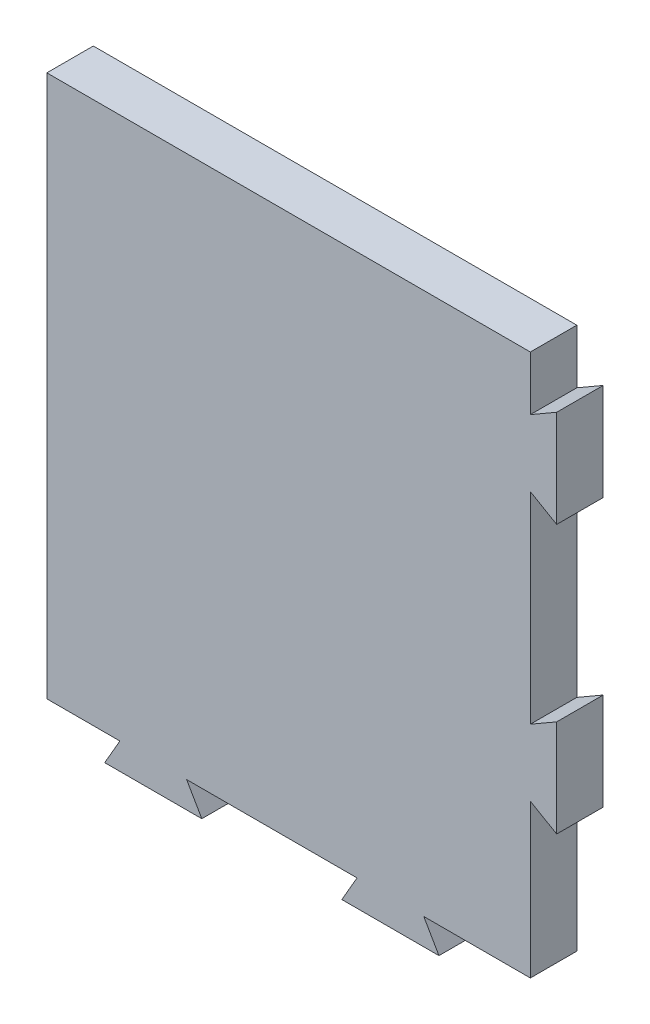
ISO-10303-21;
HEADER;
FILE_DESCRIPTION(('STEP AP214'),'2;1');
FILE_NAME('part.step','',(''),(''),'','','');
FILE_SCHEMA(('AUTOMOTIVE_DESIGN { 1 0 10303 214 1 1 1 1 }'));
ENDSEC;
DATA;
#1=APPLICATION_CONTEXT('core data for automotive mechanical design processes');
#2=APPLICATION_PROTOCOL_DEFINITION('international standard','automotive_design',2000,#1);
#3=PRODUCT_CONTEXT('',#1,'mechanical');
#4=PRODUCT('Part','Part','',(#3));
#5=PRODUCT_RELATED_PRODUCT_CATEGORY('part','',(#4));
#6=PRODUCT_DEFINITION_FORMATION('','',#4);
#7=PRODUCT_DEFINITION_CONTEXT('part definition',#1,'design');
#8=PRODUCT_DEFINITION('design','',#6,#7);
#9=PRODUCT_DEFINITION_SHAPE('','',#8);
#10=(LENGTH_UNIT() NAMED_UNIT(*) SI_UNIT(.MILLI.,.METRE.));
#11=(NAMED_UNIT(*) PLANE_ANGLE_UNIT() SI_UNIT($,.RADIAN.));
#12=(NAMED_UNIT(*) SI_UNIT($,.STERADIAN.) SOLID_ANGLE_UNIT());
#13=UNCERTAINTY_MEASURE_WITH_UNIT(LENGTH_MEASURE(1.E-05),#10,'distance_accuracy_value','');
#14=(GEOMETRIC_REPRESENTATION_CONTEXT(3) GLOBAL_UNCERTAINTY_ASSIGNED_CONTEXT((#13)) GLOBAL_UNIT_ASSIGNED_CONTEXT((#10,
#11,#12)) REPRESENTATION_CONTEXT('',''));
#15=CARTESIAN_POINT('',(0.,0.,0.));
#16=DIRECTION('',(0.,0.,1.));
#17=DIRECTION('',(1.,0.,0.));
#18=AXIS2_PLACEMENT_3D('',#15,#16,#17);
#19=CARTESIAN_POINT('',(-18.2158697558296,0.,1.5));
#20=DIRECTION('',(-1.,0.,0.));
#21=DIRECTION('',(0.,-1.,0.));
#22=AXIS2_PLACEMENT_3D('',#19,#20,#21);
#23=PLANE('',#22);
#24=DIRECTION('',(0.,1.,0.));
#25=VECTOR('',#24,1.);
#26=CARTESIAN_POINT('',(-18.2158697558296,0.,-1.5));
#27=LINE('',#26,#25);
#28=CARTESIAN_POINT('',(-18.2158697558297,-15.5,-1.5));
#29=VERTEX_POINT('',#28);
#30=CARTESIAN_POINT('',(-18.2158697558297,19.5,-1.5));
#31=VERTEX_POINT('',#30);
#32=EDGE_CURVE('E213',#29,#31,#27,.T.);
#33=ORIENTED_EDGE('',*,*,#32,.F.);
#34=DIRECTION('',(0.,0.,-1.));
#35=VECTOR('',#34,1.);
#36=CARTESIAN_POINT('',(-18.2158697558297,-15.5,1.5));
#37=LINE('',#36,#35);
#38=CARTESIAN_POINT('',(-18.2158697558297,-15.5,1.5));
#39=VERTEX_POINT('',#38);
#40=EDGE_CURVE('E11',#39,#29,#37,.T.);
#41=ORIENTED_EDGE('',*,*,#40,.F.);
#42=DIRECTION('',(0.,1.,0.));
#43=VECTOR('',#42,1.);
#44=CARTESIAN_POINT('',(-18.2158697558296,0.,1.5));
#45=LINE('',#44,#43);
#46=CARTESIAN_POINT('',(-18.2158697558297,19.5,1.5));
#47=VERTEX_POINT('',#46);
#48=EDGE_CURVE('E273',#39,#47,#45,.T.);
#49=ORIENTED_EDGE('',*,*,#48,.T.);
#50=DIRECTION('',(0.,0.,-1.));
#51=VECTOR('',#50,1.);
#52=CARTESIAN_POINT('',(-18.2158697558297,19.5,1.5));
#53=LINE('',#52,#51);
#54=EDGE_CURVE('E126',#47,#31,#53,.T.);
#55=ORIENTED_EDGE('',*,*,#54,.T.);
#56=EDGE_LOOP('',(#33,#41,#49,#55));
#57=FACE_BOUND('',#56,.T.);
#58=ADVANCED_FACE('F39',(#57),#23,.T.);
#59=CARTESIAN_POINT('',(0.,-15.5,1.50000000000001));
#60=DIRECTION('',(0.,-1.,0.));
#61=DIRECTION('',(1.,0.,0.));
#62=AXIS2_PLACEMENT_3D('',#59,#60,#61);
#63=PLANE('',#62);
#64=DIRECTION('',(-1.,0.,0.));
#65=VECTOR('',#64,1.);
#66=CARTESIAN_POINT('',(0.,-15.5,-1.49999999999999));
#67=LINE('',#66,#65);
#68=CARTESIAN_POINT('',(-13.498889300107,-15.5,-1.4999999999999));
#69=VERTEX_POINT('',#68);
#70=EDGE_CURVE('E217',#69,#29,#67,.T.);
#71=ORIENTED_EDGE('',*,*,#70,.F.);
#72=DIRECTION('',(0.,0.,-1.));
#73=VECTOR('',#72,1.);
#74=CARTESIAN_POINT('',(-13.498889300107,-15.5,1.5000000000001));
#75=LINE('',#74,#73);
#76=CARTESIAN_POINT('',(-13.498889300107,-15.5,1.5000000000001));
#77=VERTEX_POINT('',#76);
#78=EDGE_CURVE('E48',#77,#69,#75,.T.);
#79=ORIENTED_EDGE('',*,*,#78,.F.);
#80=DIRECTION('',(-1.,0.,0.));
#81=VECTOR('',#80,1.);
#82=CARTESIAN_POINT('',(0.,-15.5,1.50000000000001));
#83=LINE('',#82,#81);
#84=EDGE_CURVE('E361',#77,#39,#83,.T.);
#85=ORIENTED_EDGE('',*,*,#84,.T.);
#86=ORIENTED_EDGE('',*,*,#40,.T.);
#87=EDGE_LOOP('',(#71,#79,#85,#86));
#88=FACE_BOUND('',#87,.T.);
#89=ADVANCED_FACE('F336',(#88),#63,.T.);
#90=CARTESIAN_POINT('',(-3.41247009575071,1.97019052838325,1.5));
#91=DIRECTION('',(-0.866025403784436,0.500000000000004,0.));
#92=DIRECTION('',(-0.500000000000004,-0.866025403784436,0.));
#93=AXIS2_PLACEMENT_3D('',#90,#91,#92);
#94=PLANE('',#93);
#95=DIRECTION('',(0.500000000000012,0.866025403784451,0.));
#96=VECTOR('',#95,1.);
#97=CARTESIAN_POINT('',(-3.41247009575071,1.97019052838325,-1.5));
#98=LINE('',#97,#96);
#99=CARTESIAN_POINT('',(-14.4803847577293,-17.2,-1.49999999999981));
#100=VERTEX_POINT('',#99);
#101=EDGE_CURVE('E221',#100,#69,#98,.T.);
#102=ORIENTED_EDGE('',*,*,#101,.F.);
#103=DIRECTION('',(0.,0.,-1.));
#104=VECTOR('',#103,1.);
#105=CARTESIAN_POINT('',(-14.4803847577293,-17.2,1.50000000000019));
#106=LINE('',#105,#104);
#107=CARTESIAN_POINT('',(-14.4803847577293,-17.2,1.50000000000019));
#108=VERTEX_POINT('',#107);
#109=EDGE_CURVE('E323',#108,#100,#106,.T.);
#110=ORIENTED_EDGE('',*,*,#109,.F.);
#111=DIRECTION('',(0.500000000000012,0.866025403784451,0.));
#112=VECTOR('',#111,1.);
#113=CARTESIAN_POINT('',(-3.41247009575071,1.97019052838325,1.5));
#114=LINE('',#113,#112);
#115=EDGE_CURVE('E332',#108,#77,#114,.T.);
#116=ORIENTED_EDGE('',*,*,#115,.T.);
#117=ORIENTED_EDGE('',*,*,#78,.T.);
#118=EDGE_LOOP('',(#102,#110,#116,#117));
#119=FACE_BOUND('',#118,.T.);
#120=ADVANCED_FACE('F330',(#119),#94,.T.);
#121=CARTESIAN_POINT('',(3.7470027081099E-13,-17.2,1.5));
#122=DIRECTION('',(0.,1.,0.));
#123=DIRECTION('',(-1.,0.,0.));
#124=AXIS2_PLACEMENT_3D('',#121,#122,#123);
#125=PLANE('',#124);
#126=DIRECTION('',(1.00000000000002,0.,0.));
#127=VECTOR('',#126,1.);
#128=CARTESIAN_POINT('',(3.7470027081099E-13,-17.2,-1.5));
#129=LINE('',#128,#127);
#130=CARTESIAN_POINT('',(-8.21021416551144,-17.2,-1.49999999999981));
#131=VERTEX_POINT('',#130);
#132=EDGE_CURVE('E227',#100,#131,#129,.T.);
#133=ORIENTED_EDGE('',*,*,#132,.T.);
#134=DIRECTION('',(0.,0.,-1.));
#135=VECTOR('',#134,1.);
#136=CARTESIAN_POINT('',(-8.21021416551144,-17.2,1.50000000000019));
#137=LINE('',#136,#135);
#138=CARTESIAN_POINT('',(-8.21021416551144,-17.2,1.50000000000019));
#139=VERTEX_POINT('',#138);
#140=EDGE_CURVE('E319',#139,#131,#137,.T.);
#141=ORIENTED_EDGE('',*,*,#140,.F.);
#142=DIRECTION('',(1.00000000000002,0.,0.));
#143=VECTOR('',#142,1.);
#144=CARTESIAN_POINT('',(3.7470027081099E-13,-17.2,1.5));
#145=LINE('',#144,#143);
#146=EDGE_CURVE('E355',#108,#139,#145,.T.);
#147=ORIENTED_EDGE('',*,*,#146,.F.);
#148=ORIENTED_EDGE('',*,*,#109,.T.);
#149=EDGE_LOOP('',(#133,#141,#147,#148));
#150=FACE_BOUND('',#149,.T.);
#151=ADVANCED_FACE('F344',(#150),#125,.F.);
#152=CARTESIAN_POINT('',(-13.6054790966803,-7.85512701892239,1.50000000000019));
#153=DIRECTION('',(-0.866025403784438,-0.500000000000001,0.));
#154=DIRECTION('',(0.500000000000002,-0.866025403784438,0.));
#155=AXIS2_PLACEMENT_3D('',#152,#153,#154);
#156=PLANE('',#155);
#157=DIRECTION('',(-0.500000000000012,0.866025403784456,0.));
#158=VECTOR('',#157,1.);
#159=CARTESIAN_POINT('',(-13.6054790966803,-7.85512701892239,-1.49999999999981));
#160=LINE('',#159,#158);
#161=CARTESIAN_POINT('',(-9.19170962313455,-15.5,-1.4999999999999));
#162=VERTEX_POINT('',#161);
#163=EDGE_CURVE('E230',#131,#162,#160,.T.);
#164=ORIENTED_EDGE('',*,*,#163,.T.);
#165=DIRECTION('',(0.,0.,-1.));
#166=VECTOR('',#165,1.);
#167=CARTESIAN_POINT('',(-9.19170962313455,-15.5,1.5000000000001));
#168=LINE('',#167,#166);
#169=CARTESIAN_POINT('',(-9.19170962313455,-15.5,1.5000000000001));
#170=VERTEX_POINT('',#169);
#171=EDGE_CURVE('E316',#170,#162,#168,.T.);
#172=ORIENTED_EDGE('',*,*,#171,.F.);
#173=DIRECTION('',(-0.500000000000012,0.866025403784456,0.));
#174=VECTOR('',#173,1.);
#175=CARTESIAN_POINT('',(-13.6054790966803,-7.85512701892239,1.50000000000019));
#176=LINE('',#175,#174);
#177=EDGE_CURVE('E350',#139,#170,#176,.T.);
#178=ORIENTED_EDGE('',*,*,#177,.F.);
#179=ORIENTED_EDGE('',*,*,#140,.T.);
#180=EDGE_LOOP('',(#164,#172,#178,#179));
#181=FACE_BOUND('',#180,.T.);
#182=ADVANCED_FACE('F348',(#181),#156,.F.);
#183=CARTESIAN_POINT('',(1.810511776652,-15.5000000000002,-1.49999999999976));
#184=VERTEX_POINT('',#183);
#185=EDGE_CURVE('E223',#184,#162,#67,.T.);
#186=ORIENTED_EDGE('',*,*,#185,.F.);
#187=DIRECTION('',(0.,0.,-1.));
#188=VECTOR('',#187,1.);
#189=CARTESIAN_POINT('',(1.810511776652,-15.5000000000002,1.50000000000024));
#190=LINE('',#189,#188);
#191=CARTESIAN_POINT('',(1.810511776652,-15.5000000000002,1.50000000000024));
#192=VERTEX_POINT('',#191);
#193=EDGE_CURVE('E313',#192,#184,#190,.T.);
#194=ORIENTED_EDGE('',*,*,#193,.F.);
#195=EDGE_CURVE('E354',#192,#170,#83,.T.);
#196=ORIENTED_EDGE('',*,*,#195,.T.);
#197=ORIENTED_EDGE('',*,*,#171,.T.);
#198=EDGE_LOOP('',(#186,#194,#196,#197));
#199=FACE_BOUND('',#198,.T.);
#200=ADVANCED_FACE('F415',(#199),#63,.T.);
#201=CARTESIAN_POINT('',(8.06958071181899,-4.65897459621567,1.50000000000048));
#202=DIRECTION('',(-0.866025403784441,0.499999999999995,0.));
#203=DIRECTION('',(-0.499999999999995,-0.866025403784441,0.));
#204=AXIS2_PLACEMENT_3D('',#201,#202,#203);
#205=PLANE('',#204);
#206=DIRECTION('',(0.500000000000017,0.866025403784478,0.));
#207=VECTOR('',#206,1.);
#208=CARTESIAN_POINT('',(8.06958071181899,-4.65897459621567,-1.49999999999952));
#209=LINE('',#208,#207);
#210=CARTESIAN_POINT('',(0.829016319029145,-17.2,-1.49999999999952));
#211=VERTEX_POINT('',#210);
#212=EDGE_CURVE('E234',#211,#184,#209,.T.);
#213=ORIENTED_EDGE('',*,*,#212,.F.);
#214=DIRECTION('',(0.,0.,-1.));
#215=VECTOR('',#214,1.);
#216=CARTESIAN_POINT('',(0.829016319029145,-17.2,1.50000000000048));
#217=LINE('',#216,#215);
#218=CARTESIAN_POINT('',(0.829016319029145,-17.2,1.50000000000048));
#219=VERTEX_POINT('',#218);
#220=EDGE_CURVE('E310',#219,#211,#217,.T.);
#221=ORIENTED_EDGE('',*,*,#220,.F.);
#222=DIRECTION('',(0.500000000000017,0.866025403784478,0.));
#223=VECTOR('',#222,1.);
#224=CARTESIAN_POINT('',(8.06958071181899,-4.65897459621567,1.50000000000048));
#225=LINE('',#224,#223);
#226=EDGE_CURVE('E359',#219,#192,#225,.T.);
#227=ORIENTED_EDGE('',*,*,#226,.T.);
#228=ORIENTED_EDGE('',*,*,#193,.T.);
#229=EDGE_LOOP('',(#213,#221,#227,#228));
#230=FACE_BOUND('',#229,.T.);
#231=ADVANCED_FACE('F449',(#230),#205,.T.);
#232=CARTESIAN_POINT('',(9.64506252643105E-13,-17.2,1.5));
#233=DIRECTION('',(0.,1.,0.));
#234=DIRECTION('',(-1.,0.,0.));
#235=AXIS2_PLACEMENT_3D('',#232,#233,#234);
#236=PLANE('',#235);
#237=DIRECTION('',(1.00000000000004,0.,0.));
#238=VECTOR('',#237,1.);
#239=CARTESIAN_POINT('',(9.64506252643105E-13,-17.2,-1.5));
#240=LINE('',#239,#238);
#241=CARTESIAN_POINT('',(7.09918691124727,-17.2,-1.49999999999952));
#242=VERTEX_POINT('',#241);
#243=EDGE_CURVE('E238',#211,#242,#240,.T.);
#244=ORIENTED_EDGE('',*,*,#243,.T.);
#245=DIRECTION('',(0.,0.,-1.));
#246=VECTOR('',#245,1.);
#247=CARTESIAN_POINT('',(7.09918691124727,-17.2,1.50000000000048));
#248=LINE('',#247,#246);
#249=CARTESIAN_POINT('',(7.09918691124727,-17.2,1.50000000000048));
#250=VERTEX_POINT('',#249);
#251=EDGE_CURVE('E306',#250,#242,#248,.T.);
#252=ORIENTED_EDGE('',*,*,#251,.F.);
#253=DIRECTION('',(1.00000000000004,0.,0.));
#254=VECTOR('',#253,1.);
#255=CARTESIAN_POINT('',(9.64506252643105E-13,-17.2,1.5));
#256=LINE('',#255,#254);
#257=EDGE_CURVE('E369',#219,#250,#256,.T.);
#258=ORIENTED_EDGE('',*,*,#257,.F.);
#259=ORIENTED_EDGE('',*,*,#220,.T.);
#260=EDGE_LOOP('',(#244,#252,#258,#259));
#261=FACE_BOUND('',#260,.T.);
#262=ADVANCED_FACE('F451',(#261),#236,.F.);
#263=CARTESIAN_POINT('',(-2.12342828911145,-1.22596189432336,1.5));
#264=DIRECTION('',(-0.866025403784437,-0.500000000000004,0.));
#265=DIRECTION('',(0.500000000000004,-0.866025403784437,0.));
#266=AXIS2_PLACEMENT_3D('',#263,#264,#265);
#267=PLANE('',#266);
#268=DIRECTION('',(-0.500000000000031,0.866025403784484,0.));
#269=VECTOR('',#268,1.);
#270=CARTESIAN_POINT('',(-2.12342828911145,-1.22596189432336,-1.5));
#271=LINE('',#270,#269);
#272=CARTESIAN_POINT('',(6.11769145362457,-15.5000000000002,-1.49999999999976));
#273=VERTEX_POINT('',#272);
#274=EDGE_CURVE('E241',#242,#273,#271,.T.);
#275=ORIENTED_EDGE('',*,*,#274,.T.);
#276=DIRECTION('',(0.,0.,-1.));
#277=VECTOR('',#276,1.);
#278=CARTESIAN_POINT('',(6.11769145362457,-15.5000000000002,1.50000000000024));
#279=LINE('',#278,#277);
#280=CARTESIAN_POINT('',(6.11769145362457,-15.5000000000002,1.50000000000024));
#281=VERTEX_POINT('',#280);
#282=EDGE_CURVE('E303',#281,#273,#279,.T.);
#283=ORIENTED_EDGE('',*,*,#282,.F.);
#284=DIRECTION('',(-0.500000000000031,0.866025403784484,0.));
#285=VECTOR('',#284,1.);
#286=CARTESIAN_POINT('',(-2.12342828911145,-1.22596189432336,1.5));
#287=LINE('',#286,#285);
#288=EDGE_CURVE('E372',#250,#281,#287,.T.);
#289=ORIENTED_EDGE('',*,*,#288,.F.);
#290=ORIENTED_EDGE('',*,*,#251,.T.);
#291=EDGE_LOOP('',(#275,#283,#289,#290));
#292=FACE_BOUND('',#291,.T.);
#293=ADVANCED_FACE('F438',(#292),#267,.F.);
#294=CARTESIAN_POINT('',(13.,-15.5,-1.5));
#295=VERTEX_POINT('',#294);
#296=EDGE_CURVE('E222',#295,#273,#67,.T.);
#297=ORIENTED_EDGE('',*,*,#296,.F.);
#298=DIRECTION('',(0.,0.,-1.));
#299=VECTOR('',#298,1.);
#300=CARTESIAN_POINT('',(13.,-15.5,1.5));
#301=LINE('',#300,#299);
#302=CARTESIAN_POINT('',(13.,-15.5,1.5));
#303=VERTEX_POINT('',#302);
#304=EDGE_CURVE('E300',#303,#295,#301,.T.);
#305=ORIENTED_EDGE('',*,*,#304,.F.);
#306=EDGE_CURVE('E362',#303,#281,#83,.T.);
#307=ORIENTED_EDGE('',*,*,#306,.T.);
#308=ORIENTED_EDGE('',*,*,#282,.T.);
#309=EDGE_LOOP('',(#297,#305,#307,#308));
#310=FACE_BOUND('',#309,.T.);
#311=ADVANCED_FACE('F416',(#310),#63,.T.);
#312=CARTESIAN_POINT('',(13.,0.,1.5));
#313=DIRECTION('',(-1.,0.,0.));
#314=DIRECTION('',(0.,-1.,0.));
#315=AXIS2_PLACEMENT_3D('',#312,#313,#314);
#316=PLANE('',#315);
#317=DIRECTION('',(0.,1.,0.));
#318=VECTOR('',#317,1.);
#319=CARTESIAN_POINT('',(13.,0.,-1.5));
#320=LINE('',#319,#318);
#321=CARTESIAN_POINT('',(13.0000000000009,-5.61769145362477,-1.49999999999954));
#322=VERTEX_POINT('',#321);
#323=EDGE_CURVE('E245',#295,#322,#320,.T.);
#324=ORIENTED_EDGE('',*,*,#323,.T.);
#325=DIRECTION('',(0.,0.,-1.));
#326=VECTOR('',#325,1.);
#327=CARTESIAN_POINT('',(13.0000000000009,-5.61769145362477,1.50000000000046));
#328=LINE('',#327,#326);
#329=CARTESIAN_POINT('',(13.0000000000009,-5.61769145362477,1.50000000000046));
#330=VERTEX_POINT('',#329);
#331=EDGE_CURVE('E297',#330,#322,#328,.T.);
#332=ORIENTED_EDGE('',*,*,#331,.F.);
#333=DIRECTION('',(0.,1.,0.));
#334=VECTOR('',#333,1.);
#335=CARTESIAN_POINT('',(13.,0.,1.5));
#336=LINE('',#335,#334);
#337=EDGE_CURVE('E198',#303,#330,#336,.T.);
#338=ORIENTED_EDGE('',*,*,#337,.F.);
#339=ORIENTED_EDGE('',*,*,#304,.T.);
#340=EDGE_LOOP('',(#324,#332,#338,#339));
#341=FACE_BOUND('',#340,.T.);
#342=ADVANCED_FACE('F507',(#341),#316,.F.);
#343=CARTESIAN_POINT('',(0.81746824526948,1.4158965343809,1.5));
#344=DIRECTION('',(-0.500000000000006,-0.866025403784435,0.));
#345=DIRECTION('',(0.866025403784435,-0.500000000000006,0.));
#346=AXIS2_PLACEMENT_3D('',#343,#344,#345);
#347=PLANE('',#346);
#348=DIRECTION('',(-0.866025403784527,0.500000000000059,0.));
#349=VECTOR('',#348,1.);
#350=CARTESIAN_POINT('',(0.81746824526948,1.4158965343809,-1.5));
#351=LINE('',#350,#349);
#352=CARTESIAN_POINT('',(14.7000000000025,-6.5991869112469,-1.49999999999908));
#353=VERTEX_POINT('',#352);
#354=EDGE_CURVE('E249',#353,#322,#351,.T.);
#355=ORIENTED_EDGE('',*,*,#354,.F.);
#356=DIRECTION('',(0.,0.,-1.));
#357=VECTOR('',#356,1.);
#358=CARTESIAN_POINT('',(14.7000000000025,-6.5991869112469,1.50000000000092));
#359=LINE('',#358,#357);
#360=CARTESIAN_POINT('',(14.7000000000025,-6.5991869112469,1.50000000000092));
#361=VERTEX_POINT('',#360);
#362=EDGE_CURVE('E294',#361,#353,#359,.T.);
#363=ORIENTED_EDGE('',*,*,#362,.F.);
#364=DIRECTION('',(-0.866025403784527,0.500000000000059,0.));
#365=VECTOR('',#364,1.);
#366=CARTESIAN_POINT('',(0.81746824526948,1.4158965343809,1.5));
#367=LINE('',#366,#365);
#368=EDGE_CURVE('E376',#361,#330,#367,.T.);
#369=ORIENTED_EDGE('',*,*,#368,.T.);
#370=ORIENTED_EDGE('',*,*,#331,.T.);
#371=EDGE_LOOP('',(#355,#363,#369,#370));
#372=FACE_BOUND('',#371,.T.);
#373=ADVANCED_FACE('F515',(#372),#347,.T.);
#374=CARTESIAN_POINT('',(14.700000000001,-3.64291929955129E-13,1.5));
#375=DIRECTION('',(-1.,0.,0.));
#376=DIRECTION('',(0.,-1.,0.));
#377=AXIS2_PLACEMENT_3D('',#374,#375,#376);
#378=PLANE('',#377);
#379=DIRECTION('',(0.,1.00000000000008,0.));
#380=VECTOR('',#379,1.);
#381=CARTESIAN_POINT('',(14.700000000001,-3.64291929955129E-13,-1.5));
#382=LINE('',#381,#380);
#383=CARTESIAN_POINT('',(14.7,-0.32901631902915,-1.5));
#384=VERTEX_POINT('',#383);
#385=EDGE_CURVE('E254',#353,#384,#382,.T.);
#386=ORIENTED_EDGE('',*,*,#385,.T.);
#387=DIRECTION('',(0.,0.,-1.));
#388=VECTOR('',#387,1.);
#389=CARTESIAN_POINT('',(14.7,-0.32901631902915,1.5));
#390=LINE('',#389,#388);
#391=CARTESIAN_POINT('',(14.7,-0.32901631902915,1.5));
#392=VERTEX_POINT('',#391);
#393=EDGE_CURVE('E290',#392,#384,#390,.T.);
#394=ORIENTED_EDGE('',*,*,#393,.F.);
#395=DIRECTION('',(0.,1.00000000000008,0.));
#396=VECTOR('',#395,1.);
#397=CARTESIAN_POINT('',(14.700000000001,-3.64291929955129E-13,1.5));
#398=LINE('',#397,#396);
#399=EDGE_CURVE('E380',#361,#392,#398,.T.);
#400=ORIENTED_EDGE('',*,*,#399,.F.);
#401=ORIENTED_EDGE('',*,*,#362,.T.);
#402=EDGE_LOOP('',(#386,#394,#400,#401));
#403=FACE_BOUND('',#402,.T.);
#404=ADVANCED_FACE('F526',(#403),#378,.F.);
#405=CARTESIAN_POINT('',(3.81746824526945,-6.61204895708794,1.50000000000092));
#406=DIRECTION('',(0.49999999999999,-0.866025403784444,0.));
#407=DIRECTION('',(0.866025403784444,0.49999999999999,0.));
#408=AXIS2_PLACEMENT_3D('',#405,#406,#407);
#409=PLANE('',#408);
#410=DIRECTION('',(-0.866025403784512,-0.500000000000029,0.));
#411=VECTOR('',#410,1.);
#412=CARTESIAN_POINT('',(3.81746824526945,-6.61204895708794,-1.49999999999908));
#413=LINE('',#412,#411);
#414=CARTESIAN_POINT('',(13.,-1.31051177665152,-1.5));
#415=VERTEX_POINT('',#414);
#416=EDGE_CURVE('E257',#384,#415,#413,.T.);
#417=ORIENTED_EDGE('',*,*,#416,.T.);
#418=DIRECTION('',(0.,0.,-1.));
#419=VECTOR('',#418,1.);
#420=CARTESIAN_POINT('',(13.,-1.31051177665152,1.5));
#421=LINE('',#420,#419);
#422=CARTESIAN_POINT('',(13.,-1.31051177665152,1.5));
#423=VERTEX_POINT('',#422);
#424=EDGE_CURVE('E286',#423,#415,#421,.T.);
#425=ORIENTED_EDGE('',*,*,#424,.F.);
#426=DIRECTION('',(-0.866025403784512,-0.500000000000029,0.));
#427=VECTOR('',#426,1.);
#428=CARTESIAN_POINT('',(3.81746824526945,-6.61204895708794,1.50000000000092));
#429=LINE('',#428,#427);
#430=EDGE_CURVE('E383',#392,#423,#429,.T.);
#431=ORIENTED_EDGE('',*,*,#430,.F.);
#432=ORIENTED_EDGE('',*,*,#393,.T.);
#433=EDGE_LOOP('',(#417,#425,#431,#432));
#434=FACE_BOUND('',#433,.T.);
#435=ADVANCED_FACE('F536',(#434),#409,.F.);
#436=CARTESIAN_POINT('',(13.0000000000001,11.6917096231351,-1.5));
#437=VERTEX_POINT('',#436);
#438=EDGE_CURVE('E250',#415,#437,#320,.T.);
#439=ORIENTED_EDGE('',*,*,#438,.T.);
#440=DIRECTION('',(0.,0.,-1.));
#441=VECTOR('',#440,1.);
#442=CARTESIAN_POINT('',(13.0000000000001,11.6917096231351,1.5));
#443=LINE('',#442,#441);
#444=CARTESIAN_POINT('',(13.0000000000001,11.6917096231351,1.5));
#445=VERTEX_POINT('',#444);
#446=EDGE_CURVE('E283',#445,#437,#443,.T.);
#447=ORIENTED_EDGE('',*,*,#446,.F.);
#448=EDGE_CURVE('E197',#423,#445,#336,.T.);
#449=ORIENTED_EDGE('',*,*,#448,.F.);
#450=ORIENTED_EDGE('',*,*,#424,.T.);
#451=EDGE_LOOP('',(#439,#447,#449,#450));
#452=FACE_BOUND('',#451,.T.);
#453=ADVANCED_FACE('F395',(#452),#316,.F.);
#454=CARTESIAN_POINT('',(8.31265877365302,14.3979473419504,1.50000000000062));
#455=DIRECTION('',(-0.499999999999993,-0.866025403784443,0.));
#456=DIRECTION('',(0.866025403784443,-0.499999999999993,0.));
#457=AXIS2_PLACEMENT_3D('',#454,#455,#456);
#458=PLANE('',#457);
#459=DIRECTION('',(-0.866025403784506,0.50000000000003,0.));
#460=VECTOR('',#459,1.);
#461=CARTESIAN_POINT('',(8.31265877365302,14.3979473419504,-1.49999999999938));
#462=LINE('',#461,#460);
#463=CARTESIAN_POINT('',(14.7000000000006,10.7102141655125,-1.5));
#464=VERTEX_POINT('',#463);
#465=EDGE_CURVE('E260',#464,#437,#462,.T.);
#466=ORIENTED_EDGE('',*,*,#465,.F.);
#467=DIRECTION('',(0.,0.,-1.));
#468=VECTOR('',#467,1.);
#469=CARTESIAN_POINT('',(14.7000000000006,10.7102141655125,1.5));
#470=LINE('',#469,#468);
#471=CARTESIAN_POINT('',(14.7000000000006,10.7102141655125,1.5));
#472=VERTEX_POINT('',#471);
#473=EDGE_CURVE('E280',#472,#464,#470,.T.);
#474=ORIENTED_EDGE('',*,*,#473,.F.);
#475=DIRECTION('',(-0.866025403784506,0.50000000000003,0.));
#476=VECTOR('',#475,1.);
#477=CARTESIAN_POINT('',(8.31265877365302,14.3979473419504,1.50000000000062));
#478=LINE('',#477,#476);
#479=EDGE_CURVE('E207',#472,#445,#478,.T.);
#480=ORIENTED_EDGE('',*,*,#479,.T.);
#481=ORIENTED_EDGE('',*,*,#446,.T.);
#482=EDGE_LOOP('',(#466,#474,#480,#481));
#483=FACE_BOUND('',#482,.T.);
#484=ADVANCED_FACE('F398',(#483),#458,.T.);
#485=CARTESIAN_POINT('',(14.700000000001,-2.18575157973078E-13,1.5));
#486=DIRECTION('',(1.,0.,0.));
#487=DIRECTION('',(0.,1.,0.));
#488=AXIS2_PLACEMENT_3D('',#485,#486,#487);
#489=PLANE('',#488);
#490=DIRECTION('',(0.,-1.00000000000005,0.));
#491=VECTOR('',#490,1.);
#492=CARTESIAN_POINT('',(14.700000000001,-2.18575157973078E-13,-1.5));
#493=LINE('',#492,#491);
#494=CARTESIAN_POINT('',(14.7000000000008,16.9803847577296,-1.5));
#495=VERTEX_POINT('',#494);
#496=EDGE_CURVE('E264',#495,#464,#493,.T.);
#497=ORIENTED_EDGE('',*,*,#496,.F.);
#498=DIRECTION('',(0.,0.,-1.));
#499=VECTOR('',#498,1.);
#500=CARTESIAN_POINT('',(14.7000000000008,16.9803847577296,1.5));
#501=LINE('',#500,#499);
#502=CARTESIAN_POINT('',(14.7000000000008,16.9803847577296,1.5));
#503=VERTEX_POINT('',#502);
#504=EDGE_CURVE('E190',#503,#495,#501,.T.);
#505=ORIENTED_EDGE('',*,*,#504,.F.);
#506=DIRECTION('',(0.,-1.00000000000005,0.));
#507=VECTOR('',#506,1.);
#508=CARTESIAN_POINT('',(14.700000000001,-2.18575157973078E-13,1.5));
#509=LINE('',#508,#507);
#510=EDGE_CURVE('E203',#503,#472,#509,.T.);
#511=ORIENTED_EDGE('',*,*,#510,.T.);
#512=ORIENTED_EDGE('',*,*,#473,.T.);
#513=EDGE_LOOP('',(#497,#505,#511,#512));
#514=FACE_BOUND('',#513,.T.);
#515=ADVANCED_FACE('F401',(#514),#489,.T.);
#516=CARTESIAN_POINT('',(-3.67772228311384,6.37000185048168,1.5));
#517=DIRECTION('',(-0.499999999999994,0.866025403784442,0.));
#518=DIRECTION('',(-0.866025403784442,-0.499999999999994,0.));
#519=AXIS2_PLACEMENT_3D('',#516,#517,#518);
#520=PLANE('',#519);
#521=DIRECTION('',(0.866025403784489,0.500000000000021,0.));
#522=VECTOR('',#521,1.);
#523=CARTESIAN_POINT('',(-3.67772228311384,6.37000185048168,-1.5));
#524=LINE('',#523,#522);
#525=CARTESIAN_POINT('',(13.0000000000003,15.9988893001081,-1.5));
#526=VERTEX_POINT('',#525);
#527=EDGE_CURVE('E188',#526,#495,#524,.T.);
#528=ORIENTED_EDGE('',*,*,#527,.F.);
#529=DIRECTION('',(0.,0.,-1.));
#530=VECTOR('',#529,1.);
#531=CARTESIAN_POINT('',(13.0000000000003,15.9988893001081,1.5));
#532=LINE('',#531,#530);
#533=CARTESIAN_POINT('',(13.0000000000003,15.9988893001081,1.5));
#534=VERTEX_POINT('',#533);
#535=EDGE_CURVE('E182',#534,#526,#532,.T.);
#536=ORIENTED_EDGE('',*,*,#535,.F.);
#537=DIRECTION('',(0.866025403784489,0.500000000000021,0.));
#538=VECTOR('',#537,1.);
#539=CARTESIAN_POINT('',(-3.67772228311384,6.37000185048168,1.5));
#540=LINE('',#539,#538);
#541=EDGE_CURVE('E186',#534,#503,#540,.T.);
#542=ORIENTED_EDGE('',*,*,#541,.T.);
#543=ORIENTED_EDGE('',*,*,#504,.T.);
#544=EDGE_LOOP('',(#528,#536,#542,#543));
#545=FACE_BOUND('',#544,.T.);
#546=ADVANCED_FACE('F184',(#545),#520,.T.);
#547=CARTESIAN_POINT('',(13.,19.5,-1.5));
#548=VERTEX_POINT('',#547);
#549=EDGE_CURVE('E119',#526,#548,#320,.T.);
#550=ORIENTED_EDGE('',*,*,#549,.T.);
#551=DIRECTION('',(0.,0.,-1.));
#552=VECTOR('',#551,1.);
#553=CARTESIAN_POINT('',(13.,19.5,1.5));
#554=LINE('',#553,#552);
#555=CARTESIAN_POINT('',(13.,19.5,1.5));
#556=VERTEX_POINT('',#555);
#557=EDGE_CURVE('E191',#556,#548,#554,.T.);
#558=ORIENTED_EDGE('',*,*,#557,.F.);
#559=EDGE_CURVE('E193',#534,#556,#336,.T.);
#560=ORIENTED_EDGE('',*,*,#559,.F.);
#561=ORIENTED_EDGE('',*,*,#535,.T.);
#562=EDGE_LOOP('',(#550,#558,#560,#561));
#563=FACE_BOUND('',#562,.T.);
#564=ADVANCED_FACE('F194',(#563),#316,.F.);
#565=CARTESIAN_POINT('',(0.,19.5,1.50000000000001));
#566=DIRECTION('',(0.,-1.,0.));
#567=DIRECTION('',(1.,0.,0.));
#568=AXIS2_PLACEMENT_3D('',#565,#566,#567);
#569=PLANE('',#568);
#570=DIRECTION('',(-1.,0.,0.));
#571=VECTOR('',#570,1.);
#572=CARTESIAN_POINT('',(0.,19.5,-1.49999999999999));
#573=LINE('',#572,#571);
#574=EDGE_CURVE('E270',#548,#31,#573,.T.);
#575=ORIENTED_EDGE('',*,*,#574,.T.);
#576=ORIENTED_EDGE('',*,*,#54,.F.);
#577=DIRECTION('',(-1.,0.,0.));
#578=VECTOR('',#577,1.);
#579=CARTESIAN_POINT('',(0.,19.5,1.50000000000001));
#580=LINE('',#579,#578);
#581=EDGE_CURVE('E56',#556,#47,#580,.T.);
#582=ORIENTED_EDGE('',*,*,#581,.F.);
#583=ORIENTED_EDGE('',*,*,#557,.T.);
#584=EDGE_LOOP('',(#575,#576,#582,#583));
#585=FACE_BOUND('',#584,.T.);
#586=ADVANCED_FACE('F419',(#585),#569,.F.);
#587=CARTESIAN_POINT('',(0.,0.,1.5));
#588=DIRECTION('',(0.,0.,1.));
#589=DIRECTION('',(1.,0.,0.));
#590=AXIS2_PLACEMENT_3D('',#587,#588,#589);
#591=PLANE('',#590);
#592=ORIENTED_EDGE('',*,*,#48,.F.);
#593=ORIENTED_EDGE('',*,*,#84,.F.);
#594=ORIENTED_EDGE('',*,*,#115,.F.);
#595=ORIENTED_EDGE('',*,*,#146,.T.);
#596=ORIENTED_EDGE('',*,*,#177,.T.);
#597=ORIENTED_EDGE('',*,*,#195,.F.);
#598=ORIENTED_EDGE('',*,*,#226,.F.);
#599=ORIENTED_EDGE('',*,*,#257,.T.);
#600=ORIENTED_EDGE('',*,*,#288,.T.);
#601=ORIENTED_EDGE('',*,*,#306,.F.);
#602=ORIENTED_EDGE('',*,*,#337,.T.);
#603=ORIENTED_EDGE('',*,*,#368,.F.);
#604=ORIENTED_EDGE('',*,*,#399,.T.);
#605=ORIENTED_EDGE('',*,*,#430,.T.);
#606=ORIENTED_EDGE('',*,*,#448,.T.);
#607=ORIENTED_EDGE('',*,*,#479,.F.);
#608=ORIENTED_EDGE('',*,*,#510,.F.);
#609=ORIENTED_EDGE('',*,*,#541,.F.);
#610=ORIENTED_EDGE('',*,*,#559,.T.);
#611=ORIENTED_EDGE('',*,*,#581,.T.);
#612=EDGE_LOOP('',(#592,#593,#594,#595,#596,#597,#598,#599,#600,#601,#602,#603,#604,#605,#606,
#607,#608,#609,#610,#611));
#613=FACE_BOUND('',#612,.T.);
#614=ADVANCED_FACE('F200',(#613),#591,.T.);
#615=CARTESIAN_POINT('',(0.,0.,-1.5));
#616=DIRECTION('',(0.,0.,1.));
#617=DIRECTION('',(1.,0.,0.));
#618=AXIS2_PLACEMENT_3D('',#615,#616,#617);
#619=PLANE('',#618);
#620=ORIENTED_EDGE('',*,*,#32,.T.);
#621=ORIENTED_EDGE('',*,*,#574,.F.);
#622=ORIENTED_EDGE('',*,*,#549,.F.);
#623=ORIENTED_EDGE('',*,*,#527,.T.);
#624=ORIENTED_EDGE('',*,*,#496,.T.);
#625=ORIENTED_EDGE('',*,*,#465,.T.);
#626=ORIENTED_EDGE('',*,*,#438,.F.);
#627=ORIENTED_EDGE('',*,*,#416,.F.);
#628=ORIENTED_EDGE('',*,*,#385,.F.);
#629=ORIENTED_EDGE('',*,*,#354,.T.);
#630=ORIENTED_EDGE('',*,*,#323,.F.);
#631=ORIENTED_EDGE('',*,*,#296,.T.);
#632=ORIENTED_EDGE('',*,*,#274,.F.);
#633=ORIENTED_EDGE('',*,*,#243,.F.);
#634=ORIENTED_EDGE('',*,*,#212,.T.);
#635=ORIENTED_EDGE('',*,*,#185,.T.);
#636=ORIENTED_EDGE('',*,*,#163,.F.);
#637=ORIENTED_EDGE('',*,*,#132,.F.);
#638=ORIENTED_EDGE('',*,*,#101,.T.);
#639=ORIENTED_EDGE('',*,*,#70,.T.);
#640=EDGE_LOOP('',(#620,#621,#622,#623,#624,#625,#626,#627,#628,#629,#630,#631,#632,#633,#634,
#635,#636,#637,#638,#639));
#641=FACE_BOUND('',#640,.T.);
#642=ADVANCED_FACE('F339',(#641),#619,.F.);
#643=CLOSED_SHELL('',(#58,#89,#120,#151,#182,#200,#231,#262,#293,#311,#342,#373,#404,#435,#453,
#484,#515,#546,#564,#586,#614,#642));
#644=MANIFOLD_SOLID_BREP('B2',#643);
#645=ADVANCED_BREP_SHAPE_REPRESENTATION('',(#18,#644),#14);
#646=SHAPE_DEFINITION_REPRESENTATION(#9,#645);
ENDSEC;
END-ISO-10303-21;
